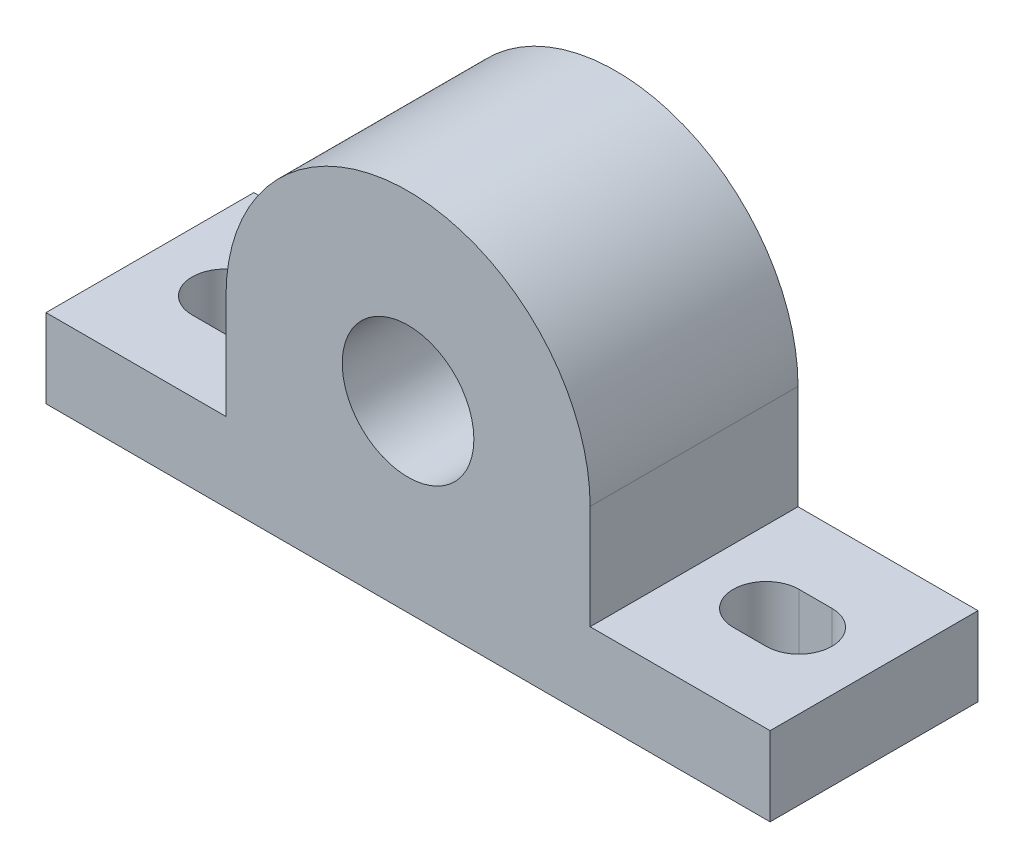
ISO-10303-21;
HEADER;
FILE_DESCRIPTION(('STEP AP214'),'2;1');
FILE_NAME('part.step','',(''),(''),'','','');
FILE_SCHEMA(('AUTOMOTIVE_DESIGN { 1 0 10303 214 1 1 1 1 }'));
ENDSEC;
DATA;
#1=APPLICATION_CONTEXT('core data for automotive mechanical design processes');
#2=APPLICATION_PROTOCOL_DEFINITION('international standard','automotive_design',2000,#1);
#3=PRODUCT_CONTEXT('',#1,'mechanical');
#4=PRODUCT('Part','Part','',(#3));
#5=PRODUCT_RELATED_PRODUCT_CATEGORY('part','',(#4));
#6=PRODUCT_DEFINITION_FORMATION('','',#4);
#7=PRODUCT_DEFINITION_CONTEXT('part definition',#1,'design');
#8=PRODUCT_DEFINITION('design','',#6,#7);
#9=PRODUCT_DEFINITION_SHAPE('','',#8);
#10=(LENGTH_UNIT() NAMED_UNIT(*) SI_UNIT(.MILLI.,.METRE.));
#11=(NAMED_UNIT(*) PLANE_ANGLE_UNIT() SI_UNIT($,.RADIAN.));
#12=(NAMED_UNIT(*) SI_UNIT($,.STERADIAN.) SOLID_ANGLE_UNIT());
#13=UNCERTAINTY_MEASURE_WITH_UNIT(LENGTH_MEASURE(1.E-05),#10,'distance_accuracy_value','');
#14=(GEOMETRIC_REPRESENTATION_CONTEXT(3) GLOBAL_UNCERTAINTY_ASSIGNED_CONTEXT((#13)) GLOBAL_UNIT_ASSIGNED_CONTEXT((#10,
#11,#12)) REPRESENTATION_CONTEXT('',''));
#15=CARTESIAN_POINT('',(0.,0.,0.));
#16=DIRECTION('',(0.,0.,1.));
#17=DIRECTION('',(1.,0.,0.));
#18=AXIS2_PLACEMENT_3D('',#15,#16,#17);
#19=CARTESIAN_POINT('',(-69.85,15.24,40.1066));
#20=DIRECTION('',(0.,-1.,0.));
#21=DIRECTION('',(1.,0.,0.));
#22=AXIS2_PLACEMENT_3D('',#19,#20,#21);
#23=PLANE('',#22);
#24=DIRECTION('',(-1.,0.,0.));
#25=VECTOR('',#24,1.);
#26=CARTESIAN_POINT('',(-69.85,15.24,0.));
#27=LINE('',#26,#25);
#28=CARTESIAN_POINT('',(-35.1282,15.24,0.));
#29=VERTEX_POINT('',#28);
#30=CARTESIAN_POINT('',(-69.85,15.24,0.));
#31=VERTEX_POINT('',#30);
#32=EDGE_CURVE('E369',#29,#31,#27,.T.);
#33=ORIENTED_EDGE('',*,*,#32,.T.);
#34=DIRECTION('',(0.,0.,-1.));
#35=VECTOR('',#34,1.);
#36=CARTESIAN_POINT('',(-69.85,15.24,40.1066));
#37=LINE('',#36,#35);
#38=CARTESIAN_POINT('',(-69.85,15.24,40.1066));
#39=VERTEX_POINT('',#38);
#40=EDGE_CURVE('E383',#39,#31,#37,.T.);
#41=ORIENTED_EDGE('',*,*,#40,.F.);
#42=DIRECTION('',(-1.,0.,0.));
#43=VECTOR('',#42,1.);
#44=CARTESIAN_POINT('',(-69.85,15.24,40.1066));
#45=LINE('',#44,#43);
#46=CARTESIAN_POINT('',(-35.1282,15.24,40.1066));
#47=VERTEX_POINT('',#46);
#48=EDGE_CURVE('E381',#47,#39,#45,.T.);
#49=ORIENTED_EDGE('',*,*,#48,.F.);
#50=DIRECTION('',(0.,0.,-1.));
#51=VECTOR('',#50,1.);
#52=CARTESIAN_POINT('',(-35.1282,15.24,40.1066));
#53=LINE('',#52,#51);
#54=EDGE_CURVE('E401',#47,#29,#53,.T.);
#55=ORIENTED_EDGE('',*,*,#54,.T.);
#56=EDGE_LOOP('',(#33,#41,#49,#55));
#57=FACE_BOUND('',#56,.T.);
#58=CARTESIAN_POINT('',(-49.022,15.24,20.0533));
#59=DIRECTION('',(0.,1.,0.));
#60=DIRECTION('',(0.,0.,1.));
#61=AXIS2_PLACEMENT_3D('',#58,#59,#60);
#62=CIRCLE('',#61,6.35);
#63=CARTESIAN_POINT('',(-49.022,15.24,26.4033));
#64=VERTEX_POINT('',#63);
#65=CARTESIAN_POINT('',(-49.022,15.24,13.7033));
#66=VERTEX_POINT('',#65);
#67=EDGE_CURVE('E347',#64,#66,#62,.T.);
#68=ORIENTED_EDGE('',*,*,#67,.F.);
#69=DIRECTION('',(1.,0.,0.));
#70=VECTOR('',#69,1.);
#71=CARTESIAN_POINT('',(-55.372,15.24,26.4033));
#72=LINE('',#71,#70);
#73=CARTESIAN_POINT('',(-55.372,15.24,26.4033));
#74=VERTEX_POINT('',#73);
#75=EDGE_CURVE('E326',#74,#64,#72,.T.);
#76=ORIENTED_EDGE('',*,*,#75,.F.);
#77=CARTESIAN_POINT('',(-55.372,15.24,20.0533));
#78=DIRECTION('',(0.,1.,0.));
#79=DIRECTION('',(0.,0.,1.));
#80=AXIS2_PLACEMENT_3D('',#77,#78,#79);
#81=CIRCLE('',#80,6.35);
#82=CARTESIAN_POINT('',(-55.372,15.24,13.7033));
#83=VERTEX_POINT('',#82);
#84=EDGE_CURVE('E337',#83,#74,#81,.T.);
#85=ORIENTED_EDGE('',*,*,#84,.F.);
#86=DIRECTION('',(1.,0.,0.));
#87=VECTOR('',#86,1.);
#88=CARTESIAN_POINT('',(-55.372,15.24,13.7033));
#89=LINE('',#88,#87);
#90=EDGE_CURVE('E334',#83,#66,#89,.T.);
#91=ORIENTED_EDGE('',*,*,#90,.T.);
#92=EDGE_LOOP('',(#68,#76,#85,#91));
#93=FACE_BOUND('',#92,.T.);
#94=ADVANCED_FACE('F181',(#57,#93),#23,.F.);
#95=CARTESIAN_POINT('',(0.,35.3568,40.1066));
#96=DIRECTION('',(0.,0.,-1.));
#97=DIRECTION('',(-1.,0.,0.));
#98=AXIS2_PLACEMENT_3D('',#95,#96,#97);
#99=PLANE('',#98);
#100=DIRECTION('',(0.,-1.,0.));
#101=VECTOR('',#100,1.);
#102=CARTESIAN_POINT('',(-69.85,0.,40.1066));
#103=LINE('',#102,#101);
#104=CARTESIAN_POINT('',(-69.85,0.,40.1066));
#105=VERTEX_POINT('',#104);
#106=EDGE_CURVE('E365',#39,#105,#103,.T.);
#107=ORIENTED_EDGE('',*,*,#106,.T.);
#108=DIRECTION('',(1.,0.,0.));
#109=VECTOR('',#108,1.);
#110=CARTESIAN_POINT('',(69.85,0.,40.1066));
#111=LINE('',#110,#109);
#112=CARTESIAN_POINT('',(69.85,0.,40.1066));
#113=VERTEX_POINT('',#112);
#114=EDGE_CURVE('E368',#105,#113,#111,.T.);
#115=ORIENTED_EDGE('',*,*,#114,.T.);
#116=DIRECTION('',(0.,1.,0.));
#117=VECTOR('',#116,1.);
#118=CARTESIAN_POINT('',(69.85,0.,40.1066));
#119=LINE('',#118,#117);
#120=CARTESIAN_POINT('',(69.85,15.24,40.1066));
#121=VERTEX_POINT('',#120);
#122=EDGE_CURVE('E371',#113,#121,#119,.T.);
#123=ORIENTED_EDGE('',*,*,#122,.T.);
#124=DIRECTION('',(-1.,0.,0.));
#125=VECTOR('',#124,1.);
#126=CARTESIAN_POINT('',(69.85,15.24,40.1066));
#127=LINE('',#126,#125);
#128=CARTESIAN_POINT('',(35.1282,15.24,40.1066));
#129=VERTEX_POINT('',#128);
#130=EDGE_CURVE('E373',#121,#129,#127,.T.);
#131=ORIENTED_EDGE('',*,*,#130,.T.);
#132=DIRECTION('',(0.,1.,0.));
#133=VECTOR('',#132,1.);
#134=CARTESIAN_POINT('',(35.1282,15.24,40.1066));
#135=LINE('',#134,#133);
#136=CARTESIAN_POINT('',(35.1282,35.3568,40.1066));
#137=VERTEX_POINT('',#136);
#138=EDGE_CURVE('E375',#129,#137,#135,.T.);
#139=ORIENTED_EDGE('',*,*,#138,.T.);
#140=CARTESIAN_POINT('',(0.,35.3568,40.1066));
#141=DIRECTION('',(0.,0.,1.));
#142=DIRECTION('',(-1.,0.,0.));
#143=AXIS2_PLACEMENT_3D('',#140,#141,#142);
#144=CIRCLE('',#143,35.1282);
#145=CARTESIAN_POINT('',(-35.1282,35.3568,40.1066));
#146=VERTEX_POINT('',#145);
#147=EDGE_CURVE('E377',#137,#146,#144,.T.);
#148=ORIENTED_EDGE('',*,*,#147,.T.);
#149=DIRECTION('',(0.,-1.,0.));
#150=VECTOR('',#149,1.);
#151=CARTESIAN_POINT('',(-35.1282,15.24,40.1066));
#152=LINE('',#151,#150);
#153=EDGE_CURVE('E379',#146,#47,#152,.T.);
#154=ORIENTED_EDGE('',*,*,#153,.T.);
#155=ORIENTED_EDGE('',*,*,#48,.T.);
#156=EDGE_LOOP('',(#107,#115,#123,#131,#139,#148,#154,#155));
#157=FACE_BOUND('',#156,.T.);
#158=CARTESIAN_POINT('',(0.,35.3568,40.1066));
#159=DIRECTION('',(0.,0.,1.));
#160=DIRECTION('',(1.,0.,0.));
#161=AXIS2_PLACEMENT_3D('',#158,#159,#160);
#162=CIRCLE('',#161,12.7);
#163=CARTESIAN_POINT('',(12.7,35.3568,40.1066));
#164=VERTEX_POINT('',#163);
#165=EDGE_CURVE('E359',#164,#164,#162,.T.);
#166=ORIENTED_EDGE('',*,*,#165,.F.);
#167=EDGE_LOOP('',(#166));
#168=FACE_BOUND('',#167,.T.);
#169=ADVANCED_FACE('F440',(#157,#168),#99,.F.);
#170=CARTESIAN_POINT('',(0.,35.3568,0.));
#171=DIRECTION('',(0.,0.,-1.));
#172=DIRECTION('',(-1.,0.,0.));
#173=AXIS2_PLACEMENT_3D('',#170,#171,#172);
#174=PLANE('',#173);
#175=DIRECTION('',(0.,-1.,0.));
#176=VECTOR('',#175,1.);
#177=CARTESIAN_POINT('',(-69.85,0.,0.));
#178=LINE('',#177,#176);
#179=CARTESIAN_POINT('',(-69.85,0.,0.));
#180=VERTEX_POINT('',#179);
#181=EDGE_CURVE('E362',#31,#180,#178,.T.);
#182=ORIENTED_EDGE('',*,*,#181,.F.);
#183=ORIENTED_EDGE('',*,*,#32,.F.);
#184=DIRECTION('',(0.,-1.,0.));
#185=VECTOR('',#184,1.);
#186=CARTESIAN_POINT('',(-35.1282,15.24,0.));
#187=LINE('',#186,#185);
#188=CARTESIAN_POINT('',(-35.1282,35.3568,0.));
#189=VERTEX_POINT('',#188);
#190=EDGE_CURVE('E396',#189,#29,#187,.T.);
#191=ORIENTED_EDGE('',*,*,#190,.F.);
#192=CARTESIAN_POINT('',(0.,35.3568,0.));
#193=DIRECTION('',(0.,0.,1.));
#194=DIRECTION('',(-1.,0.,0.));
#195=AXIS2_PLACEMENT_3D('',#192,#193,#194);
#196=CIRCLE('',#195,35.1282);
#197=CARTESIAN_POINT('',(35.1282,35.3568,0.));
#198=VERTEX_POINT('',#197);
#199=EDGE_CURVE('E394',#198,#189,#196,.T.);
#200=ORIENTED_EDGE('',*,*,#199,.F.);
#201=DIRECTION('',(0.,1.,0.));
#202=VECTOR('',#201,1.);
#203=CARTESIAN_POINT('',(35.1282,15.24,0.));
#204=LINE('',#203,#202);
#205=CARTESIAN_POINT('',(35.1282,15.24,0.));
#206=VERTEX_POINT('',#205);
#207=EDGE_CURVE('E392',#206,#198,#204,.T.);
#208=ORIENTED_EDGE('',*,*,#207,.F.);
#209=DIRECTION('',(-1.,0.,0.));
#210=VECTOR('',#209,1.);
#211=CARTESIAN_POINT('',(69.85,15.24,0.));
#212=LINE('',#211,#210);
#213=CARTESIAN_POINT('',(69.85,15.24,0.));
#214=VERTEX_POINT('',#213);
#215=EDGE_CURVE('E390',#214,#206,#212,.T.);
#216=ORIENTED_EDGE('',*,*,#215,.F.);
#217=DIRECTION('',(0.,1.,0.));
#218=VECTOR('',#217,1.);
#219=CARTESIAN_POINT('',(69.85,0.,0.));
#220=LINE('',#219,#218);
#221=CARTESIAN_POINT('',(69.85,0.,0.));
#222=VERTEX_POINT('',#221);
#223=EDGE_CURVE('E388',#222,#214,#220,.T.);
#224=ORIENTED_EDGE('',*,*,#223,.F.);
#225=DIRECTION('',(1.,0.,0.));
#226=VECTOR('',#225,1.);
#227=CARTESIAN_POINT('',(69.85,0.,0.));
#228=LINE('',#227,#226);
#229=EDGE_CURVE('E386',#180,#222,#228,.T.);
#230=ORIENTED_EDGE('',*,*,#229,.F.);
#231=EDGE_LOOP('',(#182,#183,#191,#200,#208,#216,#224,#230));
#232=FACE_BOUND('',#231,.T.);
#233=CARTESIAN_POINT('',(0.,35.3568,0.));
#234=DIRECTION('',(0.,0.,1.));
#235=DIRECTION('',(1.,0.,0.));
#236=AXIS2_PLACEMENT_3D('',#233,#234,#235);
#237=CIRCLE('',#236,12.7);
#238=CARTESIAN_POINT('',(12.7,35.3568,0.));
#239=VERTEX_POINT('',#238);
#240=EDGE_CURVE('E358',#239,#239,#237,.T.);
#241=ORIENTED_EDGE('',*,*,#240,.T.);
#242=EDGE_LOOP('',(#241));
#243=FACE_BOUND('',#242,.T.);
#244=ADVANCED_FACE('F426',(#232,#243),#174,.T.);
#245=CARTESIAN_POINT('',(-69.85,0.,40.1066));
#246=DIRECTION('',(1.,0.,0.));
#247=DIRECTION('',(0.,0.,-1.));
#248=AXIS2_PLACEMENT_3D('',#245,#246,#247);
#249=PLANE('',#248);
#250=ORIENTED_EDGE('',*,*,#181,.T.);
#251=DIRECTION('',(0.,0.,-1.));
#252=VECTOR('',#251,1.);
#253=CARTESIAN_POINT('',(-69.85,0.,40.1066));
#254=LINE('',#253,#252);
#255=EDGE_CURVE('E13',#105,#180,#254,.T.);
#256=ORIENTED_EDGE('',*,*,#255,.F.);
#257=ORIENTED_EDGE('',*,*,#106,.F.);
#258=ORIENTED_EDGE('',*,*,#40,.T.);
#259=EDGE_LOOP('',(#250,#256,#257,#258));
#260=FACE_BOUND('',#259,.T.);
#261=ADVANCED_FACE('F183',(#260),#249,.F.);
#262=CARTESIAN_POINT('',(69.85,0.,40.1066));
#263=DIRECTION('',(0.,1.,0.));
#264=DIRECTION('',(0.,0.,1.));
#265=AXIS2_PLACEMENT_3D('',#262,#263,#264);
#266=PLANE('',#265);
#267=CARTESIAN_POINT('',(49.022,0.,20.0533));
#268=DIRECTION('',(0.,1.,0.));
#269=DIRECTION('',(0.,0.,1.));
#270=AXIS2_PLACEMENT_3D('',#267,#268,#269);
#271=CIRCLE('',#270,6.34999999999999);
#272=CARTESIAN_POINT('',(49.022,0.,13.7033));
#273=VERTEX_POINT('',#272);
#274=CARTESIAN_POINT('',(49.022,0.,26.4033));
#275=VERTEX_POINT('',#274);
#276=EDGE_CURVE('E201',#273,#275,#271,.T.);
#277=ORIENTED_EDGE('',*,*,#276,.T.);
#278=DIRECTION('',(1.,0.,0.));
#279=VECTOR('',#278,1.);
#280=CARTESIAN_POINT('',(49.022,0.,26.4033));
#281=LINE('',#280,#279);
#282=CARTESIAN_POINT('',(55.372,0.,26.4033));
#283=VERTEX_POINT('',#282);
#284=EDGE_CURVE('E294',#275,#283,#281,.T.);
#285=ORIENTED_EDGE('',*,*,#284,.T.);
#286=CARTESIAN_POINT('',(55.372,0.,20.0533));
#287=DIRECTION('',(0.,1.,0.));
#288=DIRECTION('',(0.,0.,1.));
#289=AXIS2_PLACEMENT_3D('',#286,#287,#288);
#290=CIRCLE('',#289,6.34999999999999);
#291=CARTESIAN_POINT('',(55.372,0.,13.7033));
#292=VERTEX_POINT('',#291);
#293=EDGE_CURVE('E321',#283,#292,#290,.T.);
#294=ORIENTED_EDGE('',*,*,#293,.T.);
#295=DIRECTION('',(1.,0.,0.));
#296=VECTOR('',#295,1.);
#297=CARTESIAN_POINT('',(49.022,0.,13.7033));
#298=LINE('',#297,#296);
#299=EDGE_CURVE('E301',#273,#292,#298,.T.);
#300=ORIENTED_EDGE('',*,*,#299,.F.);
#301=EDGE_LOOP('',(#277,#285,#294,#300));
#302=FACE_BOUND('',#301,.T.);
#303=DIRECTION('',(1.,0.,0.));
#304=VECTOR('',#303,1.);
#305=CARTESIAN_POINT('',(-55.372,0.,13.7033));
#306=LINE('',#305,#304);
#307=CARTESIAN_POINT('',(-55.372,0.,13.7033));
#308=VERTEX_POINT('',#307);
#309=CARTESIAN_POINT('',(-49.022,0.,13.7033));
#310=VERTEX_POINT('',#309);
#311=EDGE_CURVE('E331',#308,#310,#306,.T.);
#312=ORIENTED_EDGE('',*,*,#311,.F.);
#313=CARTESIAN_POINT('',(-55.372,0.,20.0533));
#314=DIRECTION('',(0.,1.,0.));
#315=DIRECTION('',(0.,0.,1.));
#316=AXIS2_PLACEMENT_3D('',#313,#314,#315);
#317=CIRCLE('',#316,6.34999999999999);
#318=CARTESIAN_POINT('',(-55.372,0.,26.4033));
#319=VERTEX_POINT('',#318);
#320=EDGE_CURVE('E340',#308,#319,#317,.T.);
#321=ORIENTED_EDGE('',*,*,#320,.T.);
#322=DIRECTION('',(1.,0.,0.));
#323=VECTOR('',#322,1.);
#324=CARTESIAN_POINT('',(-55.372,0.,26.4033));
#325=LINE('',#324,#323);
#326=CARTESIAN_POINT('',(-49.022,0.,26.4033));
#327=VERTEX_POINT('',#326);
#328=EDGE_CURVE('E328',#319,#327,#325,.T.);
#329=ORIENTED_EDGE('',*,*,#328,.T.);
#330=CARTESIAN_POINT('',(-49.022,0.,20.0533));
#331=DIRECTION('',(0.,1.,0.));
#332=DIRECTION('',(0.,0.,1.));
#333=AXIS2_PLACEMENT_3D('',#330,#331,#332);
#334=CIRCLE('',#333,6.34999999999999);
#335=EDGE_CURVE('E350',#327,#310,#334,.T.);
#336=ORIENTED_EDGE('',*,*,#335,.T.);
#337=EDGE_LOOP('',(#312,#321,#329,#336));
#338=FACE_BOUND('',#337,.T.);
#339=ORIENTED_EDGE('',*,*,#229,.T.);
#340=DIRECTION('',(0.,0.,-1.));
#341=VECTOR('',#340,1.);
#342=CARTESIAN_POINT('',(69.85,0.,40.1066));
#343=LINE('',#342,#341);
#344=EDGE_CURVE('E189',#113,#222,#343,.T.);
#345=ORIENTED_EDGE('',*,*,#344,.F.);
#346=ORIENTED_EDGE('',*,*,#114,.F.);
#347=ORIENTED_EDGE('',*,*,#255,.T.);
#348=EDGE_LOOP('',(#339,#345,#346,#347));
#349=FACE_BOUND('',#348,.T.);
#350=ADVANCED_FACE('F310',(#302,#338,#349),#266,.F.);
#351=CARTESIAN_POINT('',(69.85,0.,40.1066));
#352=DIRECTION('',(-1.,0.,0.));
#353=DIRECTION('',(0.,0.,1.));
#354=AXIS2_PLACEMENT_3D('',#351,#352,#353);
#355=PLANE('',#354);
#356=ORIENTED_EDGE('',*,*,#223,.T.);
#357=DIRECTION('',(0.,0.,-1.));
#358=VECTOR('',#357,1.);
#359=CARTESIAN_POINT('',(69.85,15.24,40.1066));
#360=LINE('',#359,#358);
#361=EDGE_CURVE('E413',#121,#214,#360,.T.);
#362=ORIENTED_EDGE('',*,*,#361,.F.);
#363=ORIENTED_EDGE('',*,*,#122,.F.);
#364=ORIENTED_EDGE('',*,*,#344,.T.);
#365=EDGE_LOOP('',(#356,#362,#363,#364));
#366=FACE_BOUND('',#365,.T.);
#367=ADVANCED_FACE('F420',(#366),#355,.F.);
#368=CARTESIAN_POINT('',(69.85,15.24,40.1066));
#369=DIRECTION('',(0.,-1.,0.));
#370=DIRECTION('',(1.,0.,0.));
#371=AXIS2_PLACEMENT_3D('',#368,#369,#370);
#372=PLANE('',#371);
#373=DIRECTION('',(1.,0.,0.));
#374=VECTOR('',#373,1.);
#375=CARTESIAN_POINT('',(49.022,15.24,13.7033));
#376=LINE('',#375,#374);
#377=CARTESIAN_POINT('',(49.022,15.24,13.7033));
#378=VERTEX_POINT('',#377);
#379=CARTESIAN_POINT('',(55.372,15.24,13.7033));
#380=VERTEX_POINT('',#379);
#381=EDGE_CURVE('E313',#378,#380,#376,.T.);
#382=ORIENTED_EDGE('',*,*,#381,.T.);
#383=CARTESIAN_POINT('',(55.372,15.24,20.0533));
#384=DIRECTION('',(0.,1.,0.));
#385=DIRECTION('',(0.,0.,1.));
#386=AXIS2_PLACEMENT_3D('',#383,#384,#385);
#387=CIRCLE('',#386,6.35);
#388=CARTESIAN_POINT('',(55.372,15.24,26.4033));
#389=VERTEX_POINT('',#388);
#390=EDGE_CURVE('E318',#389,#380,#387,.T.);
#391=ORIENTED_EDGE('',*,*,#390,.F.);
#392=DIRECTION('',(1.,0.,0.));
#393=VECTOR('',#392,1.);
#394=CARTESIAN_POINT('',(49.022,15.24,26.4033));
#395=LINE('',#394,#393);
#396=CARTESIAN_POINT('',(49.022,15.24,26.4033));
#397=VERTEX_POINT('',#396);
#398=EDGE_CURVE('E302',#397,#389,#395,.T.);
#399=ORIENTED_EDGE('',*,*,#398,.F.);
#400=CARTESIAN_POINT('',(49.022,15.24,20.0533));
#401=DIRECTION('',(0.,1.,0.));
#402=DIRECTION('',(0.,0.,1.));
#403=AXIS2_PLACEMENT_3D('',#400,#401,#402);
#404=CIRCLE('',#403,6.35);
#405=EDGE_CURVE('E306',#378,#397,#404,.T.);
#406=ORIENTED_EDGE('',*,*,#405,.F.);
#407=EDGE_LOOP('',(#382,#391,#399,#406));
#408=FACE_BOUND('',#407,.T.);
#409=ORIENTED_EDGE('',*,*,#215,.T.);
#410=DIRECTION('',(0.,0.,-1.));
#411=VECTOR('',#410,1.);
#412=CARTESIAN_POINT('',(35.1282,15.24,40.1066));
#413=LINE('',#412,#411);
#414=EDGE_CURVE('E410',#129,#206,#413,.T.);
#415=ORIENTED_EDGE('',*,*,#414,.F.);
#416=ORIENTED_EDGE('',*,*,#130,.F.);
#417=ORIENTED_EDGE('',*,*,#361,.T.);
#418=EDGE_LOOP('',(#409,#415,#416,#417));
#419=FACE_BOUND('',#418,.T.);
#420=ADVANCED_FACE('F432',(#408,#419),#372,.F.);
#421=CARTESIAN_POINT('',(35.1282,15.24,40.1066));
#422=DIRECTION('',(-1.,0.,0.));
#423=DIRECTION('',(0.,0.,1.));
#424=AXIS2_PLACEMENT_3D('',#421,#422,#423);
#425=PLANE('',#424);
#426=ORIENTED_EDGE('',*,*,#207,.T.);
#427=DIRECTION('',(0.,0.,-1.));
#428=VECTOR('',#427,1.);
#429=CARTESIAN_POINT('',(35.1282,35.3568,40.1066));
#430=LINE('',#429,#428);
#431=EDGE_CURVE('E407',#137,#198,#430,.T.);
#432=ORIENTED_EDGE('',*,*,#431,.F.);
#433=ORIENTED_EDGE('',*,*,#138,.F.);
#434=ORIENTED_EDGE('',*,*,#414,.T.);
#435=EDGE_LOOP('',(#426,#432,#433,#434));
#436=FACE_BOUND('',#435,.T.);
#437=ADVANCED_FACE('F436',(#436),#425,.F.);
#438=CARTESIAN_POINT('',(0.,35.3568,40.1066));
#439=DIRECTION('',(0.,0.,-1.));
#440=DIRECTION('',(-1.,0.,0.));
#441=AXIS2_PLACEMENT_3D('',#438,#439,#440);
#442=CYLINDRICAL_SURFACE('',#441,35.1282);
#443=ORIENTED_EDGE('',*,*,#199,.T.);
#444=DIRECTION('',(0.,0.,-1.));
#445=VECTOR('',#444,1.);
#446=CARTESIAN_POINT('',(-35.1282,35.3568,40.1066));
#447=LINE('',#446,#445);
#448=EDGE_CURVE('E404',#146,#189,#447,.T.);
#449=ORIENTED_EDGE('',*,*,#448,.F.);
#450=ORIENTED_EDGE('',*,*,#147,.F.);
#451=ORIENTED_EDGE('',*,*,#431,.T.);
#452=EDGE_LOOP('',(#443,#449,#450,#451));
#453=FACE_BOUND('',#452,.T.);
#454=ADVANCED_FACE('F457',(#453),#442,.T.);
#455=CARTESIAN_POINT('',(-35.1282,15.24,40.1066));
#456=DIRECTION('',(1.,0.,0.));
#457=DIRECTION('',(0.,0.,-1.));
#458=AXIS2_PLACEMENT_3D('',#455,#456,#457);
#459=PLANE('',#458);
#460=ORIENTED_EDGE('',*,*,#190,.T.);
#461=ORIENTED_EDGE('',*,*,#54,.F.);
#462=ORIENTED_EDGE('',*,*,#153,.F.);
#463=ORIENTED_EDGE('',*,*,#448,.T.);
#464=EDGE_LOOP('',(#460,#461,#462,#463));
#465=FACE_BOUND('',#464,.T.);
#466=ADVANCED_FACE('F455',(#465),#459,.F.);
#467=CARTESIAN_POINT('',(0.,35.3568,40.1066));
#468=DIRECTION('',(0.,0.,-1.));
#469=DIRECTION('',(-1.,0.,0.));
#470=AXIS2_PLACEMENT_3D('',#467,#468,#469);
#471=CYLINDRICAL_SURFACE('',#470,12.7);
#472=ORIENTED_EDGE('',*,*,#165,.T.);
#473=EDGE_LOOP('',(#472));
#474=FACE_BOUND('',#473,.T.);
#475=ORIENTED_EDGE('',*,*,#240,.F.);
#476=EDGE_LOOP('',(#475));
#477=FACE_BOUND('',#476,.T.);
#478=ADVANCED_FACE('F464',(#474,#477),#471,.F.);
#479=CARTESIAN_POINT('',(-49.022,15.24,20.0533));
#480=DIRECTION('',(0.,1.,0.));
#481=DIRECTION('',(0.,0.,1.));
#482=AXIS2_PLACEMENT_3D('',#479,#480,#481);
#483=CYLINDRICAL_SURFACE('',#482,6.35);
#484=ORIENTED_EDGE('',*,*,#335,.F.);
#485=DIRECTION('',(0.,1.,0.));
#486=VECTOR('',#485,1.);
#487=CARTESIAN_POINT('',(-49.022,15.24,26.4033));
#488=LINE('',#487,#486);
#489=EDGE_CURVE('E355',#64,#327,#488,.F.);
#490=ORIENTED_EDGE('',*,*,#489,.F.);
#491=ORIENTED_EDGE('',*,*,#67,.T.);
#492=DIRECTION('',(0.,1.,0.));
#493=VECTOR('',#492,1.);
#494=CARTESIAN_POINT('',(-49.022,15.24,13.7033));
#495=LINE('',#494,#493);
#496=EDGE_CURVE('E353',#310,#66,#495,.T.);
#497=ORIENTED_EDGE('',*,*,#496,.F.);
#498=EDGE_LOOP('',(#484,#490,#491,#497));
#499=FACE_BOUND('',#498,.T.);
#500=ADVANCED_FACE('F478',(#499),#483,.F.);
#501=CARTESIAN_POINT('',(-55.372,15.24,20.0533));
#502=DIRECTION('',(0.,1.,0.));
#503=DIRECTION('',(0.,0.,1.));
#504=AXIS2_PLACEMENT_3D('',#501,#502,#503);
#505=CYLINDRICAL_SURFACE('',#504,6.35);
#506=ORIENTED_EDGE('',*,*,#84,.T.);
#507=DIRECTION('',(0.,1.,0.));
#508=VECTOR('',#507,1.);
#509=CARTESIAN_POINT('',(-55.372,15.24,26.4033));
#510=LINE('',#509,#508);
#511=EDGE_CURVE('E343',#319,#74,#510,.T.);
#512=ORIENTED_EDGE('',*,*,#511,.F.);
#513=ORIENTED_EDGE('',*,*,#320,.F.);
#514=DIRECTION('',(0.,1.,0.));
#515=VECTOR('',#514,1.);
#516=CARTESIAN_POINT('',(-55.372,15.24,13.7033));
#517=LINE('',#516,#515);
#518=EDGE_CURVE('E345',#83,#308,#517,.F.);
#519=ORIENTED_EDGE('',*,*,#518,.F.);
#520=EDGE_LOOP('',(#506,#512,#513,#519));
#521=FACE_BOUND('',#520,.T.);
#522=ADVANCED_FACE('F482',(#521),#505,.F.);
#523=CARTESIAN_POINT('',(-55.372,15.24,13.7033));
#524=DIRECTION('',(0.,0.,-1.));
#525=DIRECTION('',(-1.,0.,0.));
#526=AXIS2_PLACEMENT_3D('',#523,#524,#525);
#527=PLANE('',#526);
#528=ORIENTED_EDGE('',*,*,#496,.T.);
#529=ORIENTED_EDGE('',*,*,#90,.F.);
#530=ORIENTED_EDGE('',*,*,#518,.T.);
#531=ORIENTED_EDGE('',*,*,#311,.T.);
#532=EDGE_LOOP('',(#528,#529,#530,#531));
#533=FACE_BOUND('',#532,.T.);
#534=ADVANCED_FACE('F486',(#533),#527,.F.);
#535=CARTESIAN_POINT('',(-55.372,15.24,26.4033));
#536=DIRECTION('',(0.,0.,1.));
#537=DIRECTION('',(1.,0.,0.));
#538=AXIS2_PLACEMENT_3D('',#535,#536,#537);
#539=PLANE('',#538);
#540=ORIENTED_EDGE('',*,*,#489,.T.);
#541=ORIENTED_EDGE('',*,*,#328,.F.);
#542=ORIENTED_EDGE('',*,*,#511,.T.);
#543=ORIENTED_EDGE('',*,*,#75,.T.);
#544=EDGE_LOOP('',(#540,#541,#542,#543));
#545=FACE_BOUND('',#544,.T.);
#546=ADVANCED_FACE('F490',(#545),#539,.F.);
#547=CARTESIAN_POINT('',(55.372,15.24,20.0533));
#548=DIRECTION('',(0.,1.,0.));
#549=DIRECTION('',(0.,0.,1.));
#550=AXIS2_PLACEMENT_3D('',#547,#548,#549);
#551=CYLINDRICAL_SURFACE('',#550,6.35);
#552=ORIENTED_EDGE('',*,*,#293,.F.);
#553=DIRECTION('',(0.,1.,0.));
#554=VECTOR('',#553,1.);
#555=CARTESIAN_POINT('',(55.372,15.24,26.4033));
#556=LINE('',#555,#554);
#557=EDGE_CURVE('E298',#389,#283,#556,.F.);
#558=ORIENTED_EDGE('',*,*,#557,.F.);
#559=ORIENTED_EDGE('',*,*,#390,.T.);
#560=DIRECTION('',(0.,1.,0.));
#561=VECTOR('',#560,1.);
#562=CARTESIAN_POINT('',(55.372,15.24,13.7033));
#563=LINE('',#562,#561);
#564=EDGE_CURVE('E323',#292,#380,#563,.T.);
#565=ORIENTED_EDGE('',*,*,#564,.F.);
#566=EDGE_LOOP('',(#552,#558,#559,#565));
#567=FACE_BOUND('',#566,.T.);
#568=ADVANCED_FACE('F494',(#567),#551,.F.);
#569=CARTESIAN_POINT('',(49.022,15.24,20.0533));
#570=DIRECTION('',(0.,1.,0.));
#571=DIRECTION('',(0.,0.,1.));
#572=AXIS2_PLACEMENT_3D('',#569,#570,#571);
#573=CYLINDRICAL_SURFACE('',#572,6.35);
#574=ORIENTED_EDGE('',*,*,#405,.T.);
#575=DIRECTION('',(0.,1.,0.));
#576=VECTOR('',#575,1.);
#577=CARTESIAN_POINT('',(49.022,15.24,26.4033));
#578=LINE('',#577,#576);
#579=EDGE_CURVE('E296',#275,#397,#578,.T.);
#580=ORIENTED_EDGE('',*,*,#579,.F.);
#581=ORIENTED_EDGE('',*,*,#276,.F.);
#582=DIRECTION('',(0.,1.,0.));
#583=VECTOR('',#582,1.);
#584=CARTESIAN_POINT('',(49.022,15.24,13.7033));
#585=LINE('',#584,#583);
#586=EDGE_CURVE('E196',#378,#273,#585,.F.);
#587=ORIENTED_EDGE('',*,*,#586,.F.);
#588=EDGE_LOOP('',(#574,#580,#581,#587));
#589=FACE_BOUND('',#588,.T.);
#590=ADVANCED_FACE('F304',(#589),#573,.F.);
#591=CARTESIAN_POINT('',(49.022,15.24,13.7033));
#592=DIRECTION('',(0.,0.,-1.));
#593=DIRECTION('',(-1.,0.,0.));
#594=AXIS2_PLACEMENT_3D('',#591,#592,#593);
#595=PLANE('',#594);
#596=ORIENTED_EDGE('',*,*,#564,.T.);
#597=ORIENTED_EDGE('',*,*,#381,.F.);
#598=ORIENTED_EDGE('',*,*,#586,.T.);
#599=ORIENTED_EDGE('',*,*,#299,.T.);
#600=EDGE_LOOP('',(#596,#597,#598,#599));
#601=FACE_BOUND('',#600,.T.);
#602=ADVANCED_FACE('F501',(#601),#595,.F.);
#603=CARTESIAN_POINT('',(49.022,15.24,26.4033));
#604=DIRECTION('',(0.,0.,1.));
#605=DIRECTION('',(1.,0.,0.));
#606=AXIS2_PLACEMENT_3D('',#603,#604,#605);
#607=PLANE('',#606);
#608=ORIENTED_EDGE('',*,*,#557,.T.);
#609=ORIENTED_EDGE('',*,*,#284,.F.);
#610=ORIENTED_EDGE('',*,*,#579,.T.);
#611=ORIENTED_EDGE('',*,*,#398,.T.);
#612=EDGE_LOOP('',(#608,#609,#610,#611));
#613=FACE_BOUND('',#612,.T.);
#614=ADVANCED_FACE('F295',(#613),#607,.F.);
#615=CLOSED_SHELL('',(#94,#169,#244,#261,#350,#367,#420,#437,#454,#466,#478,#500,#522,#534,#546,
#568,#590,#602,#614));
#616=MANIFOLD_SOLID_BREP('B2',#615);
#617=ADVANCED_BREP_SHAPE_REPRESENTATION('',(#18,#616),#14);
#618=SHAPE_DEFINITION_REPRESENTATION(#9,#617);
ENDSEC;
END-ISO-10303-21;
